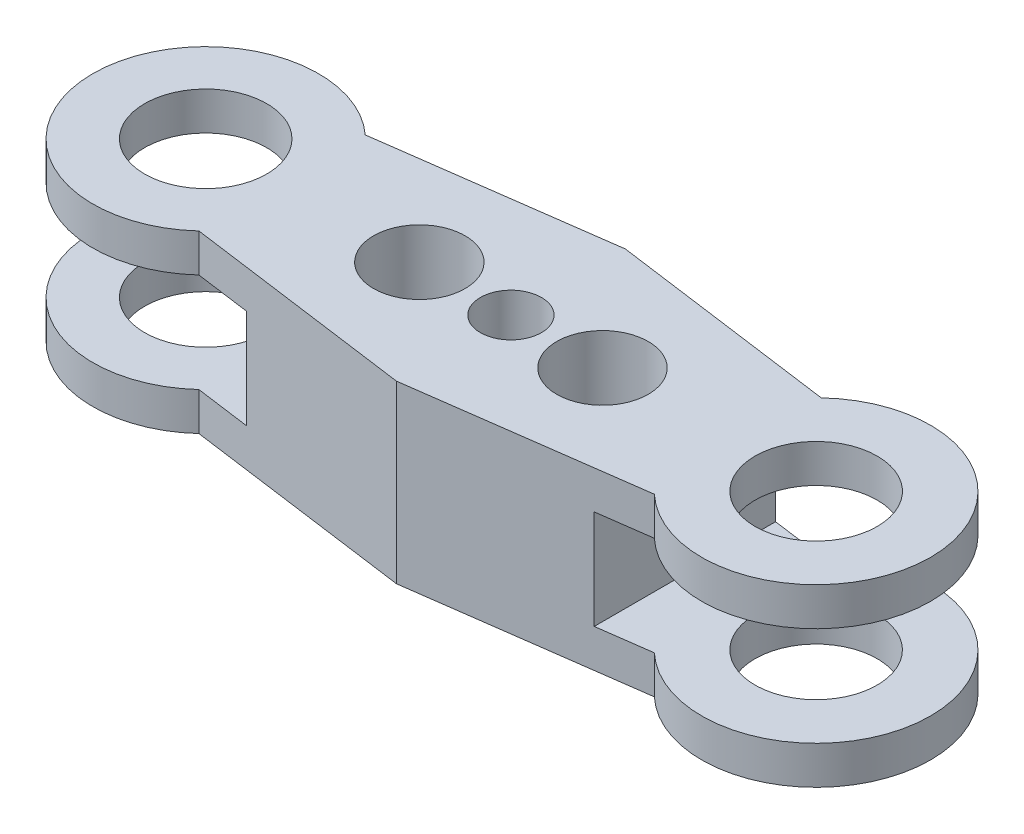
ISO-10303-21;
HEADER;
FILE_DESCRIPTION(('STEP AP214'),'2;1');
FILE_NAME('part.step','',(''),(''),'','','');
FILE_SCHEMA(('AUTOMOTIVE_DESIGN { 1 0 10303 214 1 1 1 1 }'));
ENDSEC;
DATA;
#1=APPLICATION_CONTEXT('core data for automotive mechanical design processes');
#2=APPLICATION_PROTOCOL_DEFINITION('international standard','automotive_design',2000,#1);
#3=PRODUCT_CONTEXT('',#1,'mechanical');
#4=PRODUCT('Part','Part','',(#3));
#5=PRODUCT_RELATED_PRODUCT_CATEGORY('part','',(#4));
#6=PRODUCT_DEFINITION_FORMATION('','',#4);
#7=PRODUCT_DEFINITION_CONTEXT('part definition',#1,'design');
#8=PRODUCT_DEFINITION('design','',#6,#7);
#9=PRODUCT_DEFINITION_SHAPE('','',#8);
#10=(LENGTH_UNIT() NAMED_UNIT(*) SI_UNIT(.MILLI.,.METRE.));
#11=(NAMED_UNIT(*) PLANE_ANGLE_UNIT() SI_UNIT($,.RADIAN.));
#12=(NAMED_UNIT(*) SI_UNIT($,.STERADIAN.) SOLID_ANGLE_UNIT());
#13=UNCERTAINTY_MEASURE_WITH_UNIT(LENGTH_MEASURE(1.E-05),#10,'distance_accuracy_value','');
#14=(GEOMETRIC_REPRESENTATION_CONTEXT(3) GLOBAL_UNCERTAINTY_ASSIGNED_CONTEXT((#13)) GLOBAL_UNIT_ASSIGNED_CONTEXT((#10,
#11,#12)) REPRESENTATION_CONTEXT('',''));
#15=CARTESIAN_POINT('',(0.,0.,0.));
#16=DIRECTION('',(0.,0.,1.));
#17=DIRECTION('',(1.,0.,0.));
#18=AXIS2_PLACEMENT_3D('',#15,#16,#17);
#19=CARTESIAN_POINT('',(1.00652156173425,11.5,7.36239731283313));
#20=DIRECTION('',(0.135451190306997,0.,0.99078402038205));
#21=DIRECTION('',(0.99078402038205,0.,-0.135451190306997));
#22=AXIS2_PLACEMENT_3D('',#19,#20,#21);
#23=PLANE('',#22);
#24=DIRECTION('',(0.,1.,0.));
#25=VECTOR('',#24,1.);
#26=CARTESIAN_POINT('',(11.399411805577,11.5,5.94157367690525));
#27=LINE('',#26,#25);
#28=CARTESIAN_POINT('',(11.399411805577,2.5,5.94157367690525));
#29=VERTEX_POINT('',#28);
#30=CARTESIAN_POINT('',(11.399411805577,9.,5.94157367690525));
#31=VERTEX_POINT('',#30);
#32=EDGE_CURVE('E182',#29,#31,#27,.T.);
#33=ORIENTED_EDGE('',*,*,#32,.T.);
#34=DIRECTION('',(0.99078402038205,0.,-0.135451190306997));
#35=VECTOR('',#34,1.);
#36=CARTESIAN_POINT('',(1.00652156173425,9.,7.36239731283313));
#37=LINE('',#36,#35);
#38=CARTESIAN_POINT('',(14.8662703640024,9.,5.4676155702902));
#39=VERTEX_POINT('',#38);
#40=EDGE_CURVE('E179',#31,#39,#37,.T.);
#41=ORIENTED_EDGE('',*,*,#40,.T.);
#42=DIRECTION('',(0.,-1.,0.));
#43=VECTOR('',#42,1.);
#44=CARTESIAN_POINT('',(14.8662703640024,11.5,5.4676155702902));
#45=LINE('',#44,#43);
#46=CARTESIAN_POINT('',(14.8662703640024,11.5,5.4676155702902));
#47=VERTEX_POINT('',#46);
#48=EDGE_CURVE('E265',#47,#39,#45,.T.);
#49=ORIENTED_EDGE('',*,*,#48,.F.);
#50=DIRECTION('',(-0.99078402038205,0.,0.135451190306997));
#51=VECTOR('',#50,1.);
#52=CARTESIAN_POINT('',(1.00652156173425,11.5,7.36239731283313));
#53=LINE('',#52,#51);
#54=CARTESIAN_POINT('',(0.,11.5,7.5));
#55=VERTEX_POINT('',#54);
#56=EDGE_CURVE('E202',#47,#55,#53,.T.);
#57=ORIENTED_EDGE('',*,*,#56,.T.);
#58=DIRECTION('',(0.,-1.,0.));
#59=VECTOR('',#58,1.);
#60=CARTESIAN_POINT('',(0.,11.5,7.5));
#61=LINE('',#60,#59);
#62=CARTESIAN_POINT('',(0.,0.,7.5));
#63=VERTEX_POINT('',#62);
#64=EDGE_CURVE('E218',#55,#63,#61,.T.);
#65=ORIENTED_EDGE('',*,*,#64,.T.);
#66=DIRECTION('',(-0.99078402038205,0.,0.135451190306997));
#67=VECTOR('',#66,1.);
#68=CARTESIAN_POINT('',(1.00652156173425,0.,7.36239731283313));
#69=LINE('',#68,#67);
#70=CARTESIAN_POINT('',(14.8662703640024,0.,5.4676155702902));
#71=VERTEX_POINT('',#70);
#72=EDGE_CURVE('E233',#71,#63,#69,.T.);
#73=ORIENTED_EDGE('',*,*,#72,.F.);
#74=CARTESIAN_POINT('',(14.8662703640024,2.5,5.4676155702902));
#75=VERTEX_POINT('',#74);
#76=EDGE_CURVE('E264',#75,#71,#45,.T.);
#77=ORIENTED_EDGE('',*,*,#76,.F.);
#78=DIRECTION('',(-0.99078402038205,0.,0.135451190306997));
#79=VECTOR('',#78,1.);
#80=CARTESIAN_POINT('',(1.00652156173425,2.5,7.36239731283313));
#81=LINE('',#80,#79);
#82=EDGE_CURVE('E171',#75,#29,#81,.T.);
#83=ORIENTED_EDGE('',*,*,#82,.T.);
#84=EDGE_LOOP('',(#33,#41,#49,#57,#65,#73,#77,#83));
#85=FACE_BOUND('',#84,.T.);
#86=ADVANCED_FACE('F34',(#85),#23,.T.);
#87=CARTESIAN_POINT('',(20.,11.5,0.));
#88=DIRECTION('',(0.,-1.,0.));
#89=DIRECTION('',(0.,0.,-1.));
#90=AXIS2_PLACEMENT_3D('',#87,#88,#89);
#91=CYLINDRICAL_SURFACE('',#90,7.5);
#92=CARTESIAN_POINT('',(20.,9.,0.));
#93=DIRECTION('',(0.,-1.,0.));
#94=DIRECTION('',(0.,0.,-1.));
#95=AXIS2_PLACEMENT_3D('',#92,#93,#94);
#96=CIRCLE('',#95,7.5);
#97=CARTESIAN_POINT('',(14.8662703640024,9.,-5.46761557029021));
#98=VERTEX_POINT('',#97);
#99=EDGE_CURVE('E177',#98,#39,#96,.T.);
#100=ORIENTED_EDGE('',*,*,#99,.F.);
#101=DIRECTION('',(0.,-1.,0.));
#102=VECTOR('',#101,1.);
#103=CARTESIAN_POINT('',(14.8662703640024,11.5,-5.46761557029021));
#104=LINE('',#103,#102);
#105=CARTESIAN_POINT('',(14.8662703640024,11.5,-5.46761557029021));
#106=VERTEX_POINT('',#105);
#107=EDGE_CURVE('E261',#106,#98,#104,.T.);
#108=ORIENTED_EDGE('',*,*,#107,.F.);
#109=CARTESIAN_POINT('',(20.,11.5,0.));
#110=DIRECTION('',(0.,1.,0.));
#111=DIRECTION('',(0.,0.,1.));
#112=AXIS2_PLACEMENT_3D('',#109,#110,#111);
#113=CIRCLE('',#112,7.5);
#114=EDGE_CURVE('E205',#47,#106,#113,.T.);
#115=ORIENTED_EDGE('',*,*,#114,.F.);
#116=ORIENTED_EDGE('',*,*,#48,.T.);
#117=EDGE_LOOP('',(#100,#108,#115,#116));
#118=FACE_BOUND('',#117,.T.);
#119=ADVANCED_FACE('F299',(#118),#91,.T.);
#120=CARTESIAN_POINT('',(20.,2.5,0.));
#121=DIRECTION('',(0.,1.,0.));
#122=DIRECTION('',(-1.,0.,0.));
#123=AXIS2_PLACEMENT_3D('',#120,#121,#122);
#124=CIRCLE('',#123,7.5);
#125=CARTESIAN_POINT('',(14.8662703640024,2.5,-5.46761557029021));
#126=VERTEX_POINT('',#125);
#127=EDGE_CURVE('E49',#75,#126,#124,.T.);
#128=ORIENTED_EDGE('',*,*,#127,.F.);
#129=ORIENTED_EDGE('',*,*,#76,.T.);
#130=CARTESIAN_POINT('',(20.,0.,0.));
#131=DIRECTION('',(0.,1.,0.));
#132=DIRECTION('',(0.,0.,1.));
#133=AXIS2_PLACEMENT_3D('',#130,#131,#132);
#134=CIRCLE('',#133,7.5);
#135=CARTESIAN_POINT('',(14.8662703640024,0.,-5.46761557029021));
#136=VERTEX_POINT('',#135);
#137=EDGE_CURVE('E236',#71,#136,#134,.T.);
#138=ORIENTED_EDGE('',*,*,#137,.T.);
#139=EDGE_CURVE('E260',#126,#136,#104,.T.);
#140=ORIENTED_EDGE('',*,*,#139,.F.);
#141=EDGE_LOOP('',(#128,#129,#138,#140));
#142=FACE_BOUND('',#141,.T.);
#143=ADVANCED_FACE('F333',(#142),#91,.T.);
#144=CARTESIAN_POINT('',(1.00652156173425,11.5,-7.36239731283313));
#145=DIRECTION('',(-0.135451190306996,0.,0.99078402038205));
#146=DIRECTION('',(0.99078402038205,0.,0.135451190306996));
#147=AXIS2_PLACEMENT_3D('',#144,#145,#146);
#148=PLANE('',#147);
#149=DIRECTION('',(0.99078402038205,0.,0.135451190306996));
#150=VECTOR('',#149,1.);
#151=CARTESIAN_POINT('',(1.00652156173425,9.,-7.36239731283313));
#152=LINE('',#151,#150);
#153=CARTESIAN_POINT('',(11.399411805577,9.,-5.94157367690526));
#154=VERTEX_POINT('',#153);
#155=EDGE_CURVE('E175',#154,#98,#152,.T.);
#156=ORIENTED_EDGE('',*,*,#155,.F.);
#157=DIRECTION('',(0.,1.,0.));
#158=VECTOR('',#157,1.);
#159=CARTESIAN_POINT('',(11.399411805577,11.5,-5.94157367690526));
#160=LINE('',#159,#158);
#161=CARTESIAN_POINT('',(11.399411805577,2.5,-5.94157367690525));
#162=VERTEX_POINT('',#161);
#163=EDGE_CURVE('E11',#162,#154,#160,.T.);
#164=ORIENTED_EDGE('',*,*,#163,.F.);
#165=DIRECTION('',(-0.99078402038205,0.,-0.135451190306996));
#166=VECTOR('',#165,1.);
#167=CARTESIAN_POINT('',(1.00652156173425,2.5,-7.36239731283313));
#168=LINE('',#167,#166);
#169=EDGE_CURVE('E168',#126,#162,#168,.T.);
#170=ORIENTED_EDGE('',*,*,#169,.F.);
#171=ORIENTED_EDGE('',*,*,#139,.T.);
#172=DIRECTION('',(-0.99078402038205,0.,-0.135451190306996));
#173=VECTOR('',#172,1.);
#174=CARTESIAN_POINT('',(1.00652156173425,0.,-7.36239731283313));
#175=LINE('',#174,#173);
#176=CARTESIAN_POINT('',(0.,0.,-7.5));
#177=VERTEX_POINT('',#176);
#178=EDGE_CURVE('E239',#136,#177,#175,.T.);
#179=ORIENTED_EDGE('',*,*,#178,.T.);
#180=DIRECTION('',(0.,-1.,0.));
#181=VECTOR('',#180,1.);
#182=CARTESIAN_POINT('',(0.,11.5,-7.5));
#183=LINE('',#182,#181);
#184=CARTESIAN_POINT('',(0.,11.5,-7.5));
#185=VERTEX_POINT('',#184);
#186=EDGE_CURVE('E258',#185,#177,#183,.T.);
#187=ORIENTED_EDGE('',*,*,#186,.F.);
#188=DIRECTION('',(-0.99078402038205,0.,-0.135451190306996));
#189=VECTOR('',#188,1.);
#190=CARTESIAN_POINT('',(1.00652156173425,11.5,-7.36239731283313));
#191=LINE('',#190,#189);
#192=EDGE_CURVE('E208',#106,#185,#191,.T.);
#193=ORIENTED_EDGE('',*,*,#192,.F.);
#194=ORIENTED_EDGE('',*,*,#107,.T.);
#195=EDGE_LOOP('',(#156,#164,#170,#171,#179,#187,#193,#194));
#196=FACE_BOUND('',#195,.T.);
#197=ADVANCED_FACE('F294',(#196),#148,.F.);
#198=CARTESIAN_POINT('',(-20.,11.5,0.));
#199=DIRECTION('',(0.,-1.,0.));
#200=DIRECTION('',(0.,0.,-1.));
#201=AXIS2_PLACEMENT_3D('',#198,#199,#200);
#202=CYLINDRICAL_SURFACE('',#201,7.39941180557696);
#203=DIRECTION('',(0.,-1.,0.));
#204=VECTOR('',#203,1.);
#205=CARTESIAN_POINT('',(-14.9951228717868,11.5,5.45));
#206=LINE('',#205,#204);
#207=CARTESIAN_POINT('',(-14.9951228717868,2.5,5.45));
#208=VERTEX_POINT('',#207);
#209=CARTESIAN_POINT('',(-14.9951228717868,0.,5.45));
#210=VERTEX_POINT('',#209);
#211=EDGE_CURVE('E251',#208,#210,#206,.T.);
#212=ORIENTED_EDGE('',*,*,#211,.F.);
#213=CARTESIAN_POINT('',(-20.,2.5,0.));
#214=DIRECTION('',(0.,-1.,0.));
#215=DIRECTION('',(1.,0.,0.));
#216=AXIS2_PLACEMENT_3D('',#213,#214,#215);
#217=CIRCLE('',#216,7.39941180557696);
#218=CARTESIAN_POINT('',(-14.9951228717868,2.5,-5.45000000000001));
#219=VERTEX_POINT('',#218);
#220=EDGE_CURVE('E156',#208,#219,#217,.T.);
#221=ORIENTED_EDGE('',*,*,#220,.T.);
#222=DIRECTION('',(0.,-1.,0.));
#223=VECTOR('',#222,1.);
#224=CARTESIAN_POINT('',(-14.9951228717868,11.5,-5.45000000000001));
#225=LINE('',#224,#223);
#226=CARTESIAN_POINT('',(-14.9951228717868,0.,-5.45000000000001));
#227=VERTEX_POINT('',#226);
#228=EDGE_CURVE('E255',#219,#227,#225,.T.);
#229=ORIENTED_EDGE('',*,*,#228,.T.);
#230=CARTESIAN_POINT('',(-20.,0.,0.));
#231=DIRECTION('',(0.,1.,0.));
#232=DIRECTION('',(0.,0.,1.));
#233=AXIS2_PLACEMENT_3D('',#230,#231,#232);
#234=CIRCLE('',#233,7.39941180557696);
#235=EDGE_CURVE('E245',#227,#210,#234,.T.);
#236=ORIENTED_EDGE('',*,*,#235,.T.);
#237=EDGE_LOOP('',(#212,#221,#229,#236));
#238=FACE_BOUND('',#237,.T.);
#239=ADVANCED_FACE('F330',(#238),#202,.T.);
#240=CARTESIAN_POINT('',(-20.,11.5,0.));
#241=DIRECTION('',(0.,-1.,0.));
#242=DIRECTION('',(0.,0.,-1.));
#243=AXIS2_PLACEMENT_3D('',#240,#241,#242);
#244=CYLINDRICAL_SURFACE('',#243,4.);
#245=CARTESIAN_POINT('',(-20.,2.5,0.));
#246=DIRECTION('',(0.,-1.,0.));
#247=DIRECTION('',(1.,0.,0.));
#248=AXIS2_PLACEMENT_3D('',#245,#246,#247);
#249=CIRCLE('',#248,4.);
#250=CARTESIAN_POINT('',(-16.,2.5,0.));
#251=VERTEX_POINT('',#250);
#252=EDGE_CURVE('E164',#251,#251,#249,.T.);
#253=ORIENTED_EDGE('',*,*,#252,.F.);
#254=EDGE_LOOP('',(#253));
#255=FACE_BOUND('',#254,.T.);
#256=CARTESIAN_POINT('',(-20.,0.,0.));
#257=DIRECTION('',(0.,1.,0.));
#258=DIRECTION('',(0.,0.,1.));
#259=AXIS2_PLACEMENT_3D('',#256,#257,#258);
#260=CIRCLE('',#259,4.);
#261=CARTESIAN_POINT('',(-20.,0.,4.00000000000001));
#262=VERTEX_POINT('',#261);
#263=EDGE_CURVE('E230',#262,#262,#260,.T.);
#264=ORIENTED_EDGE('',*,*,#263,.F.);
#265=EDGE_LOOP('',(#264));
#266=FACE_BOUND('',#265,.T.);
#267=ADVANCED_FACE('F351',(#255,#266),#244,.F.);
#268=CARTESIAN_POINT('',(20.,11.5,0.));
#269=DIRECTION('',(0.,-1.,0.));
#270=DIRECTION('',(0.,0.,-1.));
#271=AXIS2_PLACEMENT_3D('',#268,#269,#270);
#272=CYLINDRICAL_SURFACE('',#271,4.);
#273=CARTESIAN_POINT('',(20.,11.5,0.));
#274=DIRECTION('',(0.,1.,0.));
#275=DIRECTION('',(0.,0.,1.));
#276=AXIS2_PLACEMENT_3D('',#273,#274,#275);
#277=CIRCLE('',#276,4.);
#278=CARTESIAN_POINT('',(20.,11.5,3.99999999999999));
#279=VERTEX_POINT('',#278);
#280=EDGE_CURVE('E196',#279,#279,#277,.T.);
#281=ORIENTED_EDGE('',*,*,#280,.T.);
#282=EDGE_LOOP('',(#281));
#283=FACE_BOUND('',#282,.T.);
#284=CARTESIAN_POINT('',(20.,9.,0.));
#285=DIRECTION('',(0.,-1.,0.));
#286=DIRECTION('',(0.,0.,-1.));
#287=AXIS2_PLACEMENT_3D('',#284,#285,#286);
#288=CIRCLE('',#287,4.);
#289=CARTESIAN_POINT('',(20.,9.,-4.));
#290=VERTEX_POINT('',#289);
#291=EDGE_CURVE('E174',#290,#290,#288,.T.);
#292=ORIENTED_EDGE('',*,*,#291,.T.);
#293=EDGE_LOOP('',(#292));
#294=FACE_BOUND('',#293,.T.);
#295=ADVANCED_FACE('F277',(#283,#294),#272,.F.);
#296=CARTESIAN_POINT('',(20.,0.,0.));
#297=DIRECTION('',(0.,1.,0.));
#298=DIRECTION('',(0.,0.,1.));
#299=AXIS2_PLACEMENT_3D('',#296,#297,#298);
#300=CIRCLE('',#299,4.);
#301=CARTESIAN_POINT('',(20.,0.,3.99999999999999));
#302=VERTEX_POINT('',#301);
#303=EDGE_CURVE('E227',#302,#302,#300,.T.);
#304=ORIENTED_EDGE('',*,*,#303,.F.);
#305=EDGE_LOOP('',(#304));
#306=FACE_BOUND('',#305,.T.);
#307=CARTESIAN_POINT('',(20.,2.5,0.));
#308=DIRECTION('',(0.,1.,0.));
#309=DIRECTION('',(-1.,0.,0.));
#310=AXIS2_PLACEMENT_3D('',#307,#308,#309);
#311=CIRCLE('',#310,4.);
#312=CARTESIAN_POINT('',(16.,2.5,0.));
#313=VERTEX_POINT('',#312);
#314=EDGE_CURVE('E167',#313,#313,#311,.T.);
#315=ORIENTED_EDGE('',*,*,#314,.T.);
#316=EDGE_LOOP('',(#315));
#317=FACE_BOUND('',#316,.T.);
#318=ADVANCED_FACE('F354',(#306,#317),#272,.F.);
#319=CARTESIAN_POINT('',(-1.00652156173425,11.5,-7.36239731283313));
#320=DIRECTION('',(-0.135451190306996,0.,-0.99078402038205));
#321=DIRECTION('',(-0.99078402038205,0.,0.135451190306996));
#322=AXIS2_PLACEMENT_3D('',#319,#320,#321);
#323=PLANE('',#322);
#324=DIRECTION('',(-0.99078402038205,0.,0.135451190306996));
#325=VECTOR('',#324,1.);
#326=CARTESIAN_POINT('',(-1.00652156173425,2.5,-7.36239731283313));
#327=LINE('',#326,#325);
#328=CARTESIAN_POINT('',(-11.399411805577,2.5,-5.94157367690525));
#329=VERTEX_POINT('',#328);
#330=EDGE_CURVE('E155',#329,#219,#327,.T.);
#331=ORIENTED_EDGE('',*,*,#330,.F.);
#332=DIRECTION('',(0.,-1.,0.));
#333=VECTOR('',#332,1.);
#334=CARTESIAN_POINT('',(-11.399411805577,11.5,-5.94157367690526));
#335=LINE('',#334,#333);
#336=CARTESIAN_POINT('',(-11.399411805577,9.,-5.94157367690525));
#337=VERTEX_POINT('',#336);
#338=EDGE_CURVE('E144',#337,#329,#335,.T.);
#339=ORIENTED_EDGE('',*,*,#338,.F.);
#340=DIRECTION('',(0.99078402038205,0.,-0.135451190306996));
#341=VECTOR('',#340,1.);
#342=CARTESIAN_POINT('',(-1.00652156173425,9.,-7.36239731283313));
#343=LINE('',#342,#341);
#344=CARTESIAN_POINT('',(-14.9951228717868,9.,-5.45000000000001));
#345=VERTEX_POINT('',#344);
#346=EDGE_CURVE('E132',#345,#337,#343,.T.);
#347=ORIENTED_EDGE('',*,*,#346,.F.);
#348=CARTESIAN_POINT('',(-14.9951228717868,11.5,-5.45000000000001));
#349=VERTEX_POINT('',#348);
#350=EDGE_CURVE('E256',#349,#345,#225,.T.);
#351=ORIENTED_EDGE('',*,*,#350,.F.);
#352=DIRECTION('',(0.99078402038205,0.,-0.135451190306996));
#353=VECTOR('',#352,1.);
#354=CARTESIAN_POINT('',(-1.00652156173425,11.5,-7.36239731283313));
#355=LINE('',#354,#353);
#356=EDGE_CURVE('E210',#349,#185,#355,.T.);
#357=ORIENTED_EDGE('',*,*,#356,.T.);
#358=ORIENTED_EDGE('',*,*,#186,.T.);
#359=DIRECTION('',(0.99078402038205,0.,-0.135451190306996));
#360=VECTOR('',#359,1.);
#361=CARTESIAN_POINT('',(-1.00652156173425,0.,-7.36239731283313));
#362=LINE('',#361,#360);
#363=EDGE_CURVE('E242',#227,#177,#362,.T.);
#364=ORIENTED_EDGE('',*,*,#363,.F.);
#365=ORIENTED_EDGE('',*,*,#228,.F.);
#366=EDGE_LOOP('',(#331,#339,#347,#351,#357,#358,#364,#365));
#367=FACE_BOUND('',#366,.T.);
#368=ADVANCED_FACE('F153',(#367),#323,.T.);
#369=ORIENTED_EDGE('',*,*,#350,.T.);
#370=CARTESIAN_POINT('',(-20.,9.,0.));
#371=DIRECTION('',(0.,1.,0.));
#372=DIRECTION('',(0.,0.,1.));
#373=AXIS2_PLACEMENT_3D('',#370,#371,#372);
#374=CIRCLE('',#373,7.39941180557696);
#375=CARTESIAN_POINT('',(-14.9951228717868,9.,5.45));
#376=VERTEX_POINT('',#375);
#377=EDGE_CURVE('E135',#345,#376,#374,.T.);
#378=ORIENTED_EDGE('',*,*,#377,.T.);
#379=CARTESIAN_POINT('',(-14.9951228717868,11.5,5.45));
#380=VERTEX_POINT('',#379);
#381=EDGE_CURVE('E252',#380,#376,#206,.T.);
#382=ORIENTED_EDGE('',*,*,#381,.F.);
#383=CARTESIAN_POINT('',(-20.,11.5,0.));
#384=DIRECTION('',(0.,1.,0.));
#385=DIRECTION('',(0.,0.,1.));
#386=AXIS2_PLACEMENT_3D('',#383,#384,#385);
#387=CIRCLE('',#386,7.39941180557696);
#388=EDGE_CURVE('E213',#349,#380,#387,.T.);
#389=ORIENTED_EDGE('',*,*,#388,.F.);
#390=EDGE_LOOP('',(#369,#378,#382,#389));
#391=FACE_BOUND('',#390,.T.);
#392=ADVANCED_FACE('F317',(#391),#202,.T.);
#393=CARTESIAN_POINT('',(-20.,9.,0.));
#394=DIRECTION('',(0.,1.,0.));
#395=DIRECTION('',(0.,0.,1.));
#396=AXIS2_PLACEMENT_3D('',#393,#394,#395);
#397=CIRCLE('',#396,4.);
#398=CARTESIAN_POINT('',(-20.,9.,4.00000000000001));
#399=VERTEX_POINT('',#398);
#400=EDGE_CURVE('E139',#399,#399,#397,.T.);
#401=ORIENTED_EDGE('',*,*,#400,.F.);
#402=EDGE_LOOP('',(#401));
#403=FACE_BOUND('',#402,.T.);
#404=CARTESIAN_POINT('',(-20.,11.5,0.));
#405=DIRECTION('',(0.,1.,0.));
#406=DIRECTION('',(0.,0.,1.));
#407=AXIS2_PLACEMENT_3D('',#404,#405,#406);
#408=CIRCLE('',#407,4.);
#409=CARTESIAN_POINT('',(-20.,11.5,4.00000000000001));
#410=VERTEX_POINT('',#409);
#411=EDGE_CURVE('E199',#410,#410,#408,.T.);
#412=ORIENTED_EDGE('',*,*,#411,.T.);
#413=EDGE_LOOP('',(#412));
#414=FACE_BOUND('',#413,.T.);
#415=ADVANCED_FACE('F346',(#403,#414),#244,.F.);
#416=CARTESIAN_POINT('',(-6.,11.5,0.));
#417=DIRECTION('',(0.,-1.,0.));
#418=DIRECTION('',(0.,0.,-1.));
#419=AXIS2_PLACEMENT_3D('',#416,#417,#418);
#420=CYLINDRICAL_SURFACE('',#419,3.);
#421=CARTESIAN_POINT('',(-6.,11.5,0.));
#422=DIRECTION('',(0.,1.,0.));
#423=DIRECTION('',(0.,0.,1.));
#424=AXIS2_PLACEMENT_3D('',#421,#422,#423);
#425=CIRCLE('',#424,3.);
#426=CARTESIAN_POINT('',(-6.,11.5,3.));
#427=VERTEX_POINT('',#426);
#428=EDGE_CURVE('E193',#427,#427,#425,.T.);
#429=ORIENTED_EDGE('',*,*,#428,.T.);
#430=EDGE_LOOP('',(#429));
#431=FACE_BOUND('',#430,.T.);
#432=CARTESIAN_POINT('',(-6.,0.,0.));
#433=DIRECTION('',(0.,1.,0.));
#434=DIRECTION('',(0.,0.,1.));
#435=AXIS2_PLACEMENT_3D('',#432,#433,#434);
#436=CIRCLE('',#435,3.);
#437=CARTESIAN_POINT('',(-6.,0.,3.));
#438=VERTEX_POINT('',#437);
#439=EDGE_CURVE('E224',#438,#438,#436,.T.);
#440=ORIENTED_EDGE('',*,*,#439,.F.);
#441=EDGE_LOOP('',(#440));
#442=FACE_BOUND('',#441,.T.);
#443=ADVANCED_FACE('F349',(#431,#442),#420,.F.);
#444=CARTESIAN_POINT('',(6.,11.5,0.));
#445=DIRECTION('',(0.,-1.,0.));
#446=DIRECTION('',(0.,0.,-1.));
#447=AXIS2_PLACEMENT_3D('',#444,#445,#446);
#448=CYLINDRICAL_SURFACE('',#447,3.);
#449=CARTESIAN_POINT('',(6.,11.5,0.));
#450=DIRECTION('',(0.,1.,0.));
#451=DIRECTION('',(0.,0.,1.));
#452=AXIS2_PLACEMENT_3D('',#449,#450,#451);
#453=CIRCLE('',#452,3.);
#454=CARTESIAN_POINT('',(6.,11.5,3.));
#455=VERTEX_POINT('',#454);
#456=EDGE_CURVE('E189',#455,#455,#453,.T.);
#457=ORIENTED_EDGE('',*,*,#456,.T.);
#458=EDGE_LOOP('',(#457));
#459=FACE_BOUND('',#458,.T.);
#460=CARTESIAN_POINT('',(6.,0.,0.));
#461=DIRECTION('',(0.,1.,0.));
#462=DIRECTION('',(0.,0.,1.));
#463=AXIS2_PLACEMENT_3D('',#460,#461,#462);
#464=CIRCLE('',#463,3.);
#465=CARTESIAN_POINT('',(6.,0.,3.));
#466=VERTEX_POINT('',#465);
#467=EDGE_CURVE('E221',#466,#466,#464,.T.);
#468=ORIENTED_EDGE('',*,*,#467,.F.);
#469=EDGE_LOOP('',(#468));
#470=FACE_BOUND('',#469,.T.);
#471=ADVANCED_FACE('F357',(#459,#470),#448,.F.);
#472=CARTESIAN_POINT('',(0.,11.5,0.));
#473=DIRECTION('',(0.,-1.,0.));
#474=DIRECTION('',(0.,0.,-1.));
#475=AXIS2_PLACEMENT_3D('',#472,#473,#474);
#476=CYLINDRICAL_SURFACE('',#475,2.);
#477=CARTESIAN_POINT('',(0.,11.5,0.));
#478=DIRECTION('',(0.,1.,0.));
#479=DIRECTION('',(0.,0.,1.));
#480=AXIS2_PLACEMENT_3D('',#477,#478,#479);
#481=CIRCLE('',#480,2.);
#482=CARTESIAN_POINT('',(0.,11.5,2.));
#483=VERTEX_POINT('',#482);
#484=EDGE_CURVE('E186',#483,#483,#481,.T.);
#485=ORIENTED_EDGE('',*,*,#484,.T.);
#486=EDGE_LOOP('',(#485));
#487=FACE_BOUND('',#486,.T.);
#488=CARTESIAN_POINT('',(0.,0.,0.));
#489=DIRECTION('',(0.,1.,0.));
#490=DIRECTION('',(0.,0.,1.));
#491=AXIS2_PLACEMENT_3D('',#488,#489,#490);
#492=CIRCLE('',#491,2.);
#493=CARTESIAN_POINT('',(0.,0.,2.));
#494=VERTEX_POINT('',#493);
#495=EDGE_CURVE('E185',#494,#494,#492,.T.);
#496=ORIENTED_EDGE('',*,*,#495,.F.);
#497=EDGE_LOOP('',(#496));
#498=FACE_BOUND('',#497,.T.);
#499=ADVANCED_FACE('F36',(#487,#498),#476,.F.);
#500=CARTESIAN_POINT('',(-1.00652156173425,11.5,7.36239731283313));
#501=DIRECTION('',(0.135451190306997,0.,-0.99078402038205));
#502=DIRECTION('',(-0.99078402038205,0.,-0.135451190306997));
#503=AXIS2_PLACEMENT_3D('',#500,#501,#502);
#504=PLANE('',#503);
#505=DIRECTION('',(0.,-1.,0.));
#506=VECTOR('',#505,1.);
#507=CARTESIAN_POINT('',(-11.399411805577,11.5,5.94157367690525));
#508=LINE('',#507,#506);
#509=CARTESIAN_POINT('',(-11.399411805577,9.,5.94157367690525));
#510=VERTEX_POINT('',#509);
#511=CARTESIAN_POINT('',(-11.399411805577,2.5,5.94157367690525));
#512=VERTEX_POINT('',#511);
#513=EDGE_CURVE('E147',#510,#512,#508,.T.);
#514=ORIENTED_EDGE('',*,*,#513,.T.);
#515=DIRECTION('',(-0.99078402038205,0.,-0.135451190306997));
#516=VECTOR('',#515,1.);
#517=CARTESIAN_POINT('',(-1.00652156173425,2.5,7.36239731283313));
#518=LINE('',#517,#516);
#519=EDGE_CURVE('E42',#512,#208,#518,.T.);
#520=ORIENTED_EDGE('',*,*,#519,.T.);
#521=ORIENTED_EDGE('',*,*,#211,.T.);
#522=DIRECTION('',(0.99078402038205,0.,0.135451190306997));
#523=VECTOR('',#522,1.);
#524=CARTESIAN_POINT('',(-1.00652156173425,0.,7.36239731283313));
#525=LINE('',#524,#523);
#526=EDGE_CURVE('E190',#210,#63,#525,.T.);
#527=ORIENTED_EDGE('',*,*,#526,.T.);
#528=ORIENTED_EDGE('',*,*,#64,.F.);
#529=DIRECTION('',(0.99078402038205,0.,0.135451190306997));
#530=VECTOR('',#529,1.);
#531=CARTESIAN_POINT('',(-1.00652156173425,11.5,7.36239731283313));
#532=LINE('',#531,#530);
#533=EDGE_CURVE('E216',#380,#55,#532,.T.);
#534=ORIENTED_EDGE('',*,*,#533,.F.);
#535=ORIENTED_EDGE('',*,*,#381,.T.);
#536=DIRECTION('',(0.99078402038205,0.,0.135451190306997));
#537=VECTOR('',#536,1.);
#538=CARTESIAN_POINT('',(-1.00652156173425,9.,7.36239731283313));
#539=LINE('',#538,#537);
#540=EDGE_CURVE('E268',#376,#510,#539,.T.);
#541=ORIENTED_EDGE('',*,*,#540,.T.);
#542=EDGE_LOOP('',(#514,#520,#521,#527,#528,#534,#535,#541));
#543=FACE_BOUND('',#542,.T.);
#544=ADVANCED_FACE('F313',(#543),#504,.F.);
#545=CARTESIAN_POINT('',(0.,11.5,0.));
#546=DIRECTION('',(0.,1.,0.));
#547=DIRECTION('',(0.,0.,1.));
#548=AXIS2_PLACEMENT_3D('',#545,#546,#547);
#549=PLANE('',#548);
#550=ORIENTED_EDGE('',*,*,#484,.F.);
#551=EDGE_LOOP('',(#550));
#552=FACE_BOUND('',#551,.T.);
#553=ORIENTED_EDGE('',*,*,#456,.F.);
#554=EDGE_LOOP('',(#553));
#555=FACE_BOUND('',#554,.T.);
#556=ORIENTED_EDGE('',*,*,#428,.F.);
#557=EDGE_LOOP('',(#556));
#558=FACE_BOUND('',#557,.T.);
#559=ORIENTED_EDGE('',*,*,#280,.F.);
#560=EDGE_LOOP('',(#559));
#561=FACE_BOUND('',#560,.T.);
#562=ORIENTED_EDGE('',*,*,#411,.F.);
#563=EDGE_LOOP('',(#562));
#564=FACE_BOUND('',#563,.T.);
#565=ORIENTED_EDGE('',*,*,#56,.F.);
#566=ORIENTED_EDGE('',*,*,#114,.T.);
#567=ORIENTED_EDGE('',*,*,#192,.T.);
#568=ORIENTED_EDGE('',*,*,#356,.F.);
#569=ORIENTED_EDGE('',*,*,#388,.T.);
#570=ORIENTED_EDGE('',*,*,#533,.T.);
#571=EDGE_LOOP('',(#565,#566,#567,#568,#569,#570));
#572=FACE_BOUND('',#571,.T.);
#573=ADVANCED_FACE('F320',(#552,#555,#558,#561,#564,#572),#549,.T.);
#574=CARTESIAN_POINT('',(0.,0.,0.));
#575=DIRECTION('',(0.,1.,0.));
#576=DIRECTION('',(0.,0.,1.));
#577=AXIS2_PLACEMENT_3D('',#574,#575,#576);
#578=PLANE('',#577);
#579=ORIENTED_EDGE('',*,*,#495,.T.);
#580=EDGE_LOOP('',(#579));
#581=FACE_BOUND('',#580,.T.);
#582=ORIENTED_EDGE('',*,*,#467,.T.);
#583=EDGE_LOOP('',(#582));
#584=FACE_BOUND('',#583,.T.);
#585=ORIENTED_EDGE('',*,*,#439,.T.);
#586=EDGE_LOOP('',(#585));
#587=FACE_BOUND('',#586,.T.);
#588=ORIENTED_EDGE('',*,*,#303,.T.);
#589=EDGE_LOOP('',(#588));
#590=FACE_BOUND('',#589,.T.);
#591=ORIENTED_EDGE('',*,*,#263,.T.);
#592=EDGE_LOOP('',(#591));
#593=FACE_BOUND('',#592,.T.);
#594=ORIENTED_EDGE('',*,*,#72,.T.);
#595=ORIENTED_EDGE('',*,*,#526,.F.);
#596=ORIENTED_EDGE('',*,*,#235,.F.);
#597=ORIENTED_EDGE('',*,*,#363,.T.);
#598=ORIENTED_EDGE('',*,*,#178,.F.);
#599=ORIENTED_EDGE('',*,*,#137,.F.);
#600=EDGE_LOOP('',(#594,#595,#596,#597,#598,#599));
#601=FACE_BOUND('',#600,.T.);
#602=ADVANCED_FACE('F327',(#581,#584,#587,#590,#593,#601),#578,.F.);
#603=CARTESIAN_POINT('',(-11.399411805577,0.,50.));
#604=DIRECTION('',(1.,0.,0.));
#605=DIRECTION('',(0.,0.,-1.));
#606=AXIS2_PLACEMENT_3D('',#603,#604,#605);
#607=PLANE('',#606);
#608=ORIENTED_EDGE('',*,*,#338,.T.);
#609=DIRECTION('',(0.,0.,-1.));
#610=VECTOR('',#609,1.);
#611=CARTESIAN_POINT('',(-11.399411805577,2.5,50.));
#612=LINE('',#611,#610);
#613=EDGE_CURVE('E149',#512,#329,#612,.T.);
#614=ORIENTED_EDGE('',*,*,#613,.F.);
#615=ORIENTED_EDGE('',*,*,#513,.F.);
#616=DIRECTION('',(0.,0.,-1.));
#617=VECTOR('',#616,1.);
#618=CARTESIAN_POINT('',(-11.399411805577,9.,50.));
#619=LINE('',#618,#617);
#620=EDGE_CURVE('E57',#510,#337,#619,.T.);
#621=ORIENTED_EDGE('',*,*,#620,.T.);
#622=EDGE_LOOP('',(#608,#614,#615,#621));
#623=FACE_BOUND('',#622,.T.);
#624=ADVANCED_FACE('F142',(#623),#607,.F.);
#625=CARTESIAN_POINT('',(0.,2.5,50.));
#626=DIRECTION('',(0.,-1.,0.));
#627=DIRECTION('',(1.,0.,0.));
#628=AXIS2_PLACEMENT_3D('',#625,#626,#627);
#629=PLANE('',#628);
#630=ORIENTED_EDGE('',*,*,#252,.T.);
#631=EDGE_LOOP('',(#630));
#632=FACE_BOUND('',#631,.T.);
#633=ORIENTED_EDGE('',*,*,#330,.T.);
#634=ORIENTED_EDGE('',*,*,#220,.F.);
#635=ORIENTED_EDGE('',*,*,#519,.F.);
#636=ORIENTED_EDGE('',*,*,#613,.T.);
#637=EDGE_LOOP('',(#633,#634,#635,#636));
#638=FACE_BOUND('',#637,.T.);
#639=ADVANCED_FACE('F311',(#632,#638),#629,.F.);
#640=CARTESIAN_POINT('',(0.,9.,50.));
#641=DIRECTION('',(0.,1.,0.));
#642=DIRECTION('',(0.,0.,1.));
#643=AXIS2_PLACEMENT_3D('',#640,#641,#642);
#644=PLANE('',#643);
#645=ORIENTED_EDGE('',*,*,#400,.T.);
#646=EDGE_LOOP('',(#645));
#647=FACE_BOUND('',#646,.T.);
#648=ORIENTED_EDGE('',*,*,#346,.T.);
#649=ORIENTED_EDGE('',*,*,#620,.F.);
#650=ORIENTED_EDGE('',*,*,#540,.F.);
#651=ORIENTED_EDGE('',*,*,#377,.F.);
#652=EDGE_LOOP('',(#648,#649,#650,#651));
#653=FACE_BOUND('',#652,.T.);
#654=ADVANCED_FACE('F133',(#647,#653),#644,.F.);
#655=CARTESIAN_POINT('',(11.399411805577,0.,50.));
#656=DIRECTION('',(1.,0.,0.));
#657=DIRECTION('',(0.,0.,-1.));
#658=AXIS2_PLACEMENT_3D('',#655,#656,#657);
#659=PLANE('',#658);
#660=DIRECTION('',(0.,0.,-1.));
#661=VECTOR('',#660,1.);
#662=CARTESIAN_POINT('',(11.399411805577,2.5,50.));
#663=LINE('',#662,#661);
#664=EDGE_CURVE('E290',#29,#162,#663,.T.);
#665=ORIENTED_EDGE('',*,*,#664,.T.);
#666=ORIENTED_EDGE('',*,*,#163,.T.);
#667=DIRECTION('',(0.,0.,-1.));
#668=VECTOR('',#667,1.);
#669=CARTESIAN_POINT('',(11.399411805577,9.,50.));
#670=LINE('',#669,#668);
#671=EDGE_CURVE('E150',#31,#154,#670,.T.);
#672=ORIENTED_EDGE('',*,*,#671,.F.);
#673=ORIENTED_EDGE('',*,*,#32,.F.);
#674=EDGE_LOOP('',(#665,#666,#672,#673));
#675=FACE_BOUND('',#674,.T.);
#676=ADVANCED_FACE('F283',(#675),#659,.T.);
#677=CARTESIAN_POINT('',(0.,9.,50.));
#678=DIRECTION('',(0.,-1.,0.));
#679=DIRECTION('',(0.,0.,-1.));
#680=AXIS2_PLACEMENT_3D('',#677,#678,#679);
#681=PLANE('',#680);
#682=ORIENTED_EDGE('',*,*,#291,.F.);
#683=EDGE_LOOP('',(#682));
#684=FACE_BOUND('',#683,.T.);
#685=ORIENTED_EDGE('',*,*,#671,.T.);
#686=ORIENTED_EDGE('',*,*,#155,.T.);
#687=ORIENTED_EDGE('',*,*,#99,.T.);
#688=ORIENTED_EDGE('',*,*,#40,.F.);
#689=EDGE_LOOP('',(#685,#686,#687,#688));
#690=FACE_BOUND('',#689,.T.);
#691=ADVANCED_FACE('F279',(#684,#690),#681,.T.);
#692=CARTESIAN_POINT('',(0.,2.5,50.));
#693=DIRECTION('',(0.,1.,0.));
#694=DIRECTION('',(-1.,0.,0.));
#695=AXIS2_PLACEMENT_3D('',#692,#693,#694);
#696=PLANE('',#695);
#697=ORIENTED_EDGE('',*,*,#314,.F.);
#698=EDGE_LOOP('',(#697));
#699=FACE_BOUND('',#698,.T.);
#700=ORIENTED_EDGE('',*,*,#127,.T.);
#701=ORIENTED_EDGE('',*,*,#169,.T.);
#702=ORIENTED_EDGE('',*,*,#664,.F.);
#703=ORIENTED_EDGE('',*,*,#82,.F.);
#704=EDGE_LOOP('',(#700,#701,#702,#703));
#705=FACE_BOUND('',#704,.T.);
#706=ADVANCED_FACE('F282',(#699,#705),#696,.T.);
#707=CLOSED_SHELL('',(#86,#119,#143,#197,#239,#267,#295,#318,#368,#392,#415,#443,#471,#499,#544,
#573,#602,#624,#639,#654,#676,#691,#706));
#708=MANIFOLD_SOLID_BREP('B2',#707);
#709=ADVANCED_BREP_SHAPE_REPRESENTATION('',(#18,#708),#14);
#710=SHAPE_DEFINITION_REPRESENTATION(#9,#709);
ENDSEC;
END-ISO-10303-21;
